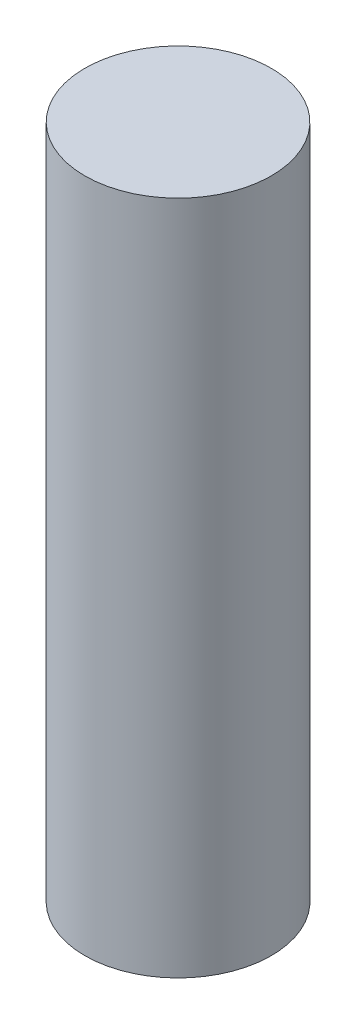
ISO-10303-21;
HEADER;
FILE_DESCRIPTION(('STEP AP214'),'2;1');
FILE_NAME('part.step','',(''),(''),'','','');
FILE_SCHEMA(('AUTOMOTIVE_DESIGN { 1 0 10303 214 1 1 1 1 }'));
ENDSEC;
DATA;
#1=APPLICATION_CONTEXT('core data for automotive mechanical design processes');
#2=APPLICATION_PROTOCOL_DEFINITION('international standard','automotive_design',2000,#1);
#3=PRODUCT_CONTEXT('',#1,'mechanical');
#4=PRODUCT('Part','Part','',(#3));
#5=PRODUCT_RELATED_PRODUCT_CATEGORY('part','',(#4));
#6=PRODUCT_DEFINITION_FORMATION('','',#4);
#7=PRODUCT_DEFINITION_CONTEXT('part definition',#1,'design');
#8=PRODUCT_DEFINITION('design','',#6,#7);
#9=PRODUCT_DEFINITION_SHAPE('','',#8);
#10=(LENGTH_UNIT() NAMED_UNIT(*) SI_UNIT(.MILLI.,.METRE.));
#11=(NAMED_UNIT(*) PLANE_ANGLE_UNIT() SI_UNIT($,.RADIAN.));
#12=(NAMED_UNIT(*) SI_UNIT($,.STERADIAN.) SOLID_ANGLE_UNIT());
#13=UNCERTAINTY_MEASURE_WITH_UNIT(LENGTH_MEASURE(1.E-05),#10,'distance_accuracy_value','');
#14=(GEOMETRIC_REPRESENTATION_CONTEXT(3) GLOBAL_UNCERTAINTY_ASSIGNED_CONTEXT((#13)) GLOBAL_UNIT_ASSIGNED_CONTEXT((#10,
#11,#12)) REPRESENTATION_CONTEXT('',''));
#15=CARTESIAN_POINT('',(0.,0.,0.));
#16=DIRECTION('',(0.,0.,1.));
#17=DIRECTION('',(1.,0.,0.));
#18=AXIS2_PLACEMENT_3D('',#15,#16,#17);
#19=CARTESIAN_POINT('',(0.,67.,0.));
#20=DIRECTION('',(0.,-1.,0.));
#21=DIRECTION('',(0.,0.,-1.));
#22=AXIS2_PLACEMENT_3D('',#19,#20,#21);
#23=CYLINDRICAL_SURFACE('',#22,9.25);
#24=CARTESIAN_POINT('',(0.,67.,0.));
#25=DIRECTION('',(0.,1.,0.));
#26=DIRECTION('',(0.,0.,1.));
#27=AXIS2_PLACEMENT_3D('',#24,#25,#26);
#28=CIRCLE('',#27,9.25);
#29=CARTESIAN_POINT('',(0.,67.,9.25));
#30=VERTEX_POINT('',#29);
#31=EDGE_CURVE('E10',#30,#30,#28,.T.);
#32=ORIENTED_EDGE('',*,*,#31,.F.);
#33=EDGE_LOOP('',(#32));
#34=FACE_BOUND('',#33,.T.);
#35=CARTESIAN_POINT('',(0.,0.,0.));
#36=DIRECTION('',(0.,1.,0.));
#37=DIRECTION('',(0.,0.,1.));
#38=AXIS2_PLACEMENT_3D('',#35,#36,#37);
#39=CIRCLE('',#38,9.25);
#40=CARTESIAN_POINT('',(0.,0.,9.25));
#41=VERTEX_POINT('',#40);
#42=EDGE_CURVE('E34',#41,#41,#39,.T.);
#43=ORIENTED_EDGE('',*,*,#42,.T.);
#44=EDGE_LOOP('',(#43));
#45=FACE_BOUND('',#44,.T.);
#46=ADVANCED_FACE('F31',(#34,#45),#23,.T.);
#47=CARTESIAN_POINT('',(0.,67.,0.));
#48=DIRECTION('',(0.,1.,0.));
#49=DIRECTION('',(0.,0.,1.));
#50=AXIS2_PLACEMENT_3D('',#47,#48,#49);
#51=PLANE('',#50);
#52=ORIENTED_EDGE('',*,*,#31,.T.);
#53=EDGE_LOOP('',(#52));
#54=FACE_BOUND('',#53,.T.);
#55=ADVANCED_FACE('F46',(#54),#51,.T.);
#56=CARTESIAN_POINT('',(0.,0.,0.));
#57=DIRECTION('',(0.,1.,0.));
#58=DIRECTION('',(0.,0.,1.));
#59=AXIS2_PLACEMENT_3D('',#56,#57,#58);
#60=PLANE('',#59);
#61=ORIENTED_EDGE('',*,*,#42,.F.);
#62=EDGE_LOOP('',(#61));
#63=FACE_BOUND('',#62,.T.);
#64=ADVANCED_FACE('F44',(#63),#60,.F.);
#65=CLOSED_SHELL('',(#46,#55,#64));
#66=MANIFOLD_SOLID_BREP('B2',#65);
#67=ADVANCED_BREP_SHAPE_REPRESENTATION('',(#18,#66),#14);
#68=SHAPE_DEFINITION_REPRESENTATION(#9,#67);
ENDSEC;
END-ISO-10303-21;
